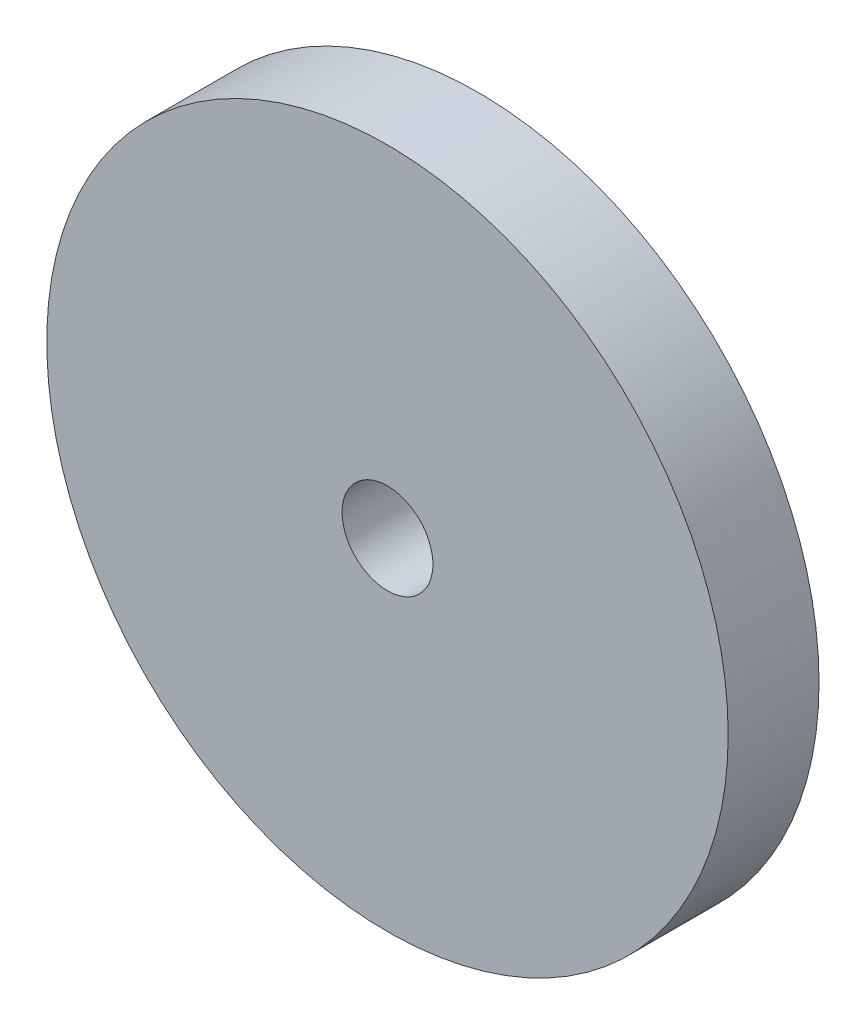
ISO-10303-21;
HEADER;
FILE_DESCRIPTION(('STEP AP214'),'2;1');
FILE_NAME('part.step','',(''),(''),'','','');
FILE_SCHEMA(('AUTOMOTIVE_DESIGN { 1 0 10303 214 1 1 1 1 }'));
ENDSEC;
DATA;
#1=APPLICATION_CONTEXT('core data for automotive mechanical design processes');
#2=APPLICATION_PROTOCOL_DEFINITION('international standard','automotive_design',2000,#1);
#3=PRODUCT_CONTEXT('',#1,'mechanical');
#4=PRODUCT('Part','Part','',(#3));
#5=PRODUCT_RELATED_PRODUCT_CATEGORY('part','',(#4));
#6=PRODUCT_DEFINITION_FORMATION('','',#4);
#7=PRODUCT_DEFINITION_CONTEXT('part definition',#1,'design');
#8=PRODUCT_DEFINITION('design','',#6,#7);
#9=PRODUCT_DEFINITION_SHAPE('','',#8);
#10=(LENGTH_UNIT() NAMED_UNIT(*) SI_UNIT(.MILLI.,.METRE.));
#11=(NAMED_UNIT(*) PLANE_ANGLE_UNIT() SI_UNIT($,.RADIAN.));
#12=(NAMED_UNIT(*) SI_UNIT($,.STERADIAN.) SOLID_ANGLE_UNIT());
#13=UNCERTAINTY_MEASURE_WITH_UNIT(LENGTH_MEASURE(1.E-05),#10,'distance_accuracy_value','');
#14=(GEOMETRIC_REPRESENTATION_CONTEXT(3) GLOBAL_UNCERTAINTY_ASSIGNED_CONTEXT((#13)) GLOBAL_UNIT_ASSIGNED_CONTEXT((#10,
#11,#12)) REPRESENTATION_CONTEXT('',''));
#15=CARTESIAN_POINT('',(0.,0.,0.));
#16=DIRECTION('',(0.,0.,1.));
#17=DIRECTION('',(1.,0.,0.));
#18=AXIS2_PLACEMENT_3D('',#15,#16,#17);
#19=CARTESIAN_POINT('',(-30.6409168862249,5.95055487355673,10.));
#20=DIRECTION('',(0.,0.,-1.));
#21=DIRECTION('',(-1.,0.,0.));
#22=AXIS2_PLACEMENT_3D('',#19,#20,#21);
#23=CYLINDRICAL_SURFACE('',#22,22.5);
#24=CARTESIAN_POINT('',(-30.6409168862249,5.95055487355673,10.));
#25=DIRECTION('',(0.,0.,1.));
#26=DIRECTION('',(1.,0.,0.));
#27=AXIS2_PLACEMENT_3D('',#24,#25,#26);
#28=CIRCLE('',#27,22.5);
#29=CARTESIAN_POINT('',(-8.14091688622494,5.95055487355673,10.));
#30=VERTEX_POINT('',#29);
#31=EDGE_CURVE('E10',#30,#30,#28,.T.);
#32=ORIENTED_EDGE('',*,*,#31,.F.);
#33=EDGE_LOOP('',(#32));
#34=FACE_BOUND('',#33,.T.);
#35=CARTESIAN_POINT('',(-30.6409168862249,5.95055487355673,0.));
#36=DIRECTION('',(0.,0.,1.));
#37=DIRECTION('',(1.,0.,0.));
#38=AXIS2_PLACEMENT_3D('',#35,#36,#37);
#39=CIRCLE('',#38,22.5);
#40=CARTESIAN_POINT('',(-8.14091688622494,5.95055487355673,0.));
#41=VERTEX_POINT('',#40);
#42=EDGE_CURVE('E38',#41,#41,#39,.T.);
#43=ORIENTED_EDGE('',*,*,#42,.T.);
#44=EDGE_LOOP('',(#43));
#45=FACE_BOUND('',#44,.T.);
#46=ADVANCED_FACE('F35',(#34,#45),#23,.T.);
#47=CARTESIAN_POINT('',(-30.6409168862249,5.95055487355673,0.));
#48=DIRECTION('',(0.,0.,1.));
#49=DIRECTION('',(1.,0.,0.));
#50=AXIS2_PLACEMENT_3D('',#47,#48,#49);
#51=PLANE('',#50);
#52=CARTESIAN_POINT('',(-30.6409168862249,5.95055487355673,0.));
#53=DIRECTION('',(0.,0.,-1.));
#54=DIRECTION('',(-1.,0.,0.));
#55=AXIS2_PLACEMENT_3D('',#52,#53,#54);
#56=CIRCLE('',#55,5.);
#57=CARTESIAN_POINT('',(-35.6409168862249,5.95055487355673,0.));
#58=VERTEX_POINT('',#57);
#59=EDGE_CURVE('E53',#58,#58,#56,.T.);
#60=ORIENTED_EDGE('',*,*,#59,.F.);
#61=EDGE_LOOP('',(#60));
#62=FACE_BOUND('',#61,.T.);
#63=ORIENTED_EDGE('',*,*,#42,.F.);
#64=EDGE_LOOP('',(#63));
#65=FACE_BOUND('',#64,.T.);
#66=ADVANCED_FACE('F69',(#62,#65),#51,.F.);
#67=CARTESIAN_POINT('',(-30.6409168862249,5.95055487355673,20.));
#68=DIRECTION('',(0.,0.,-1.));
#69=DIRECTION('',(-1.,0.,0.));
#70=AXIS2_PLACEMENT_3D('',#67,#68,#69);
#71=CYLINDRICAL_SURFACE('',#70,37.5);
#72=CARTESIAN_POINT('',(-30.6409168862249,5.95055487355673,20.));
#73=DIRECTION('',(0.,0.,1.));
#74=DIRECTION('',(1.,0.,0.));
#75=AXIS2_PLACEMENT_3D('',#72,#73,#74);
#76=CIRCLE('',#75,37.5);
#77=CARTESIAN_POINT('',(6.85908311377507,5.95055487355673,20.));
#78=VERTEX_POINT('',#77);
#79=EDGE_CURVE('E45',#78,#78,#76,.T.);
#80=ORIENTED_EDGE('',*,*,#79,.F.);
#81=EDGE_LOOP('',(#80));
#82=FACE_BOUND('',#81,.T.);
#83=CARTESIAN_POINT('',(-30.6409168862249,5.95055487355673,10.));
#84=DIRECTION('',(0.,0.,1.));
#85=DIRECTION('',(1.,0.,0.));
#86=AXIS2_PLACEMENT_3D('',#83,#84,#85);
#87=CIRCLE('',#86,37.5);
#88=CARTESIAN_POINT('',(6.85908311377507,5.95055487355673,10.));
#89=VERTEX_POINT('',#88);
#90=EDGE_CURVE('E47',#89,#89,#87,.T.);
#91=ORIENTED_EDGE('',*,*,#90,.T.);
#92=EDGE_LOOP('',(#91));
#93=FACE_BOUND('',#92,.T.);
#94=ADVANCED_FACE('F72',(#82,#93),#71,.T.);
#95=CARTESIAN_POINT('',(-30.6409168862249,5.95055487355673,20.));
#96=DIRECTION('',(0.,0.,1.));
#97=DIRECTION('',(1.,0.,0.));
#98=AXIS2_PLACEMENT_3D('',#95,#96,#97);
#99=PLANE('',#98);
#100=CARTESIAN_POINT('',(-30.6409168862249,5.95055487355673,20.));
#101=DIRECTION('',(0.,0.,-1.));
#102=DIRECTION('',(-1.,0.,0.));
#103=AXIS2_PLACEMENT_3D('',#100,#101,#102);
#104=CIRCLE('',#103,5.);
#105=CARTESIAN_POINT('',(-35.6409168862249,5.95055487355673,20.));
#106=VERTEX_POINT('',#105);
#107=EDGE_CURVE('E50',#106,#106,#104,.T.);
#108=ORIENTED_EDGE('',*,*,#107,.T.);
#109=EDGE_LOOP('',(#108));
#110=FACE_BOUND('',#109,.T.);
#111=ORIENTED_EDGE('',*,*,#79,.T.);
#112=EDGE_LOOP('',(#111));
#113=FACE_BOUND('',#112,.T.);
#114=ADVANCED_FACE('F59',(#110,#113),#99,.T.);
#115=CARTESIAN_POINT('',(-30.6409168862249,5.95055487355673,10.));
#116=DIRECTION('',(0.,0.,1.));
#117=DIRECTION('',(1.,0.,0.));
#118=AXIS2_PLACEMENT_3D('',#115,#116,#117);
#119=PLANE('',#118);
#120=ORIENTED_EDGE('',*,*,#31,.T.);
#121=EDGE_LOOP('',(#120));
#122=FACE_BOUND('',#121,.T.);
#123=ORIENTED_EDGE('',*,*,#90,.F.);
#124=EDGE_LOOP('',(#123));
#125=FACE_BOUND('',#124,.T.);
#126=ADVANCED_FACE('F65',(#122,#125),#119,.F.);
#127=CARTESIAN_POINT('',(-30.6409168862249,5.95055487355673,20.));
#128=DIRECTION('',(0.,0.,-1.));
#129=DIRECTION('',(-1.,0.,0.));
#130=AXIS2_PLACEMENT_3D('',#127,#128,#129);
#131=CYLINDRICAL_SURFACE('',#130,5.);
#132=ORIENTED_EDGE('',*,*,#107,.F.);
#133=EDGE_LOOP('',(#132));
#134=FACE_BOUND('',#133,.T.);
#135=ORIENTED_EDGE('',*,*,#59,.T.);
#136=EDGE_LOOP('',(#135));
#137=FACE_BOUND('',#136,.T.);
#138=ADVANCED_FACE('F62',(#134,#137),#131,.F.);
#139=CLOSED_SHELL('',(#46,#66,#94,#114,#126,#138));
#140=MANIFOLD_SOLID_BREP('B2',#139);
#141=ADVANCED_BREP_SHAPE_REPRESENTATION('',(#18,#140),#14);
#142=SHAPE_DEFINITION_REPRESENTATION(#9,#141);
ENDSEC;
END-ISO-10303-21;
